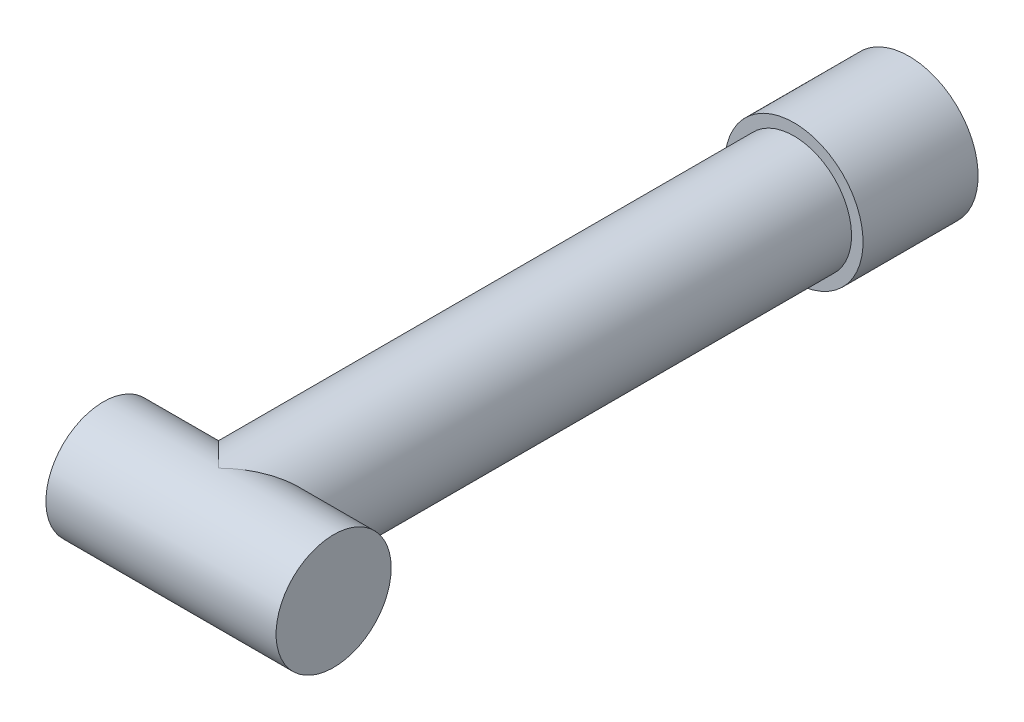
ISO-10303-21;
HEADER;
FILE_DESCRIPTION(('STEP AP214'),'2;1');
FILE_NAME('part.step','',(''),(''),'','','');
FILE_SCHEMA(('AUTOMOTIVE_DESIGN { 1 0 10303 214 1 1 1 1 }'));
ENDSEC;
DATA;
#1=APPLICATION_CONTEXT('core data for automotive mechanical design processes');
#2=APPLICATION_PROTOCOL_DEFINITION('international standard','automotive_design',2000,#1);
#3=PRODUCT_CONTEXT('',#1,'mechanical');
#4=PRODUCT('Part','Part','',(#3));
#5=PRODUCT_RELATED_PRODUCT_CATEGORY('part','',(#4));
#6=PRODUCT_DEFINITION_FORMATION('','',#4);
#7=PRODUCT_DEFINITION_CONTEXT('part definition',#1,'design');
#8=PRODUCT_DEFINITION('design','',#6,#7);
#9=PRODUCT_DEFINITION_SHAPE('','',#8);
#10=(LENGTH_UNIT() NAMED_UNIT(*) SI_UNIT(.MILLI.,.METRE.));
#11=(NAMED_UNIT(*) PLANE_ANGLE_UNIT() SI_UNIT($,.RADIAN.));
#12=(NAMED_UNIT(*) SI_UNIT($,.STERADIAN.) SOLID_ANGLE_UNIT());
#13=UNCERTAINTY_MEASURE_WITH_UNIT(LENGTH_MEASURE(1.E-05),#10,'distance_accuracy_value','');
#14=(GEOMETRIC_REPRESENTATION_CONTEXT(3) GLOBAL_UNCERTAINTY_ASSIGNED_CONTEXT((#13)) GLOBAL_UNIT_ASSIGNED_CONTEXT((#10,
#11,#12)) REPRESENTATION_CONTEXT('',''));
#15=CARTESIAN_POINT('',(0.,0.,0.));
#16=DIRECTION('',(0.,0.,1.));
#17=DIRECTION('',(1.,0.,0.));
#18=AXIS2_PLACEMENT_3D('',#15,#16,#17);
#19=CARTESIAN_POINT('',(0.,0.,-30.));
#20=DIRECTION('',(0.,0.,1.));
#21=DIRECTION('',(1.,0.,0.));
#22=AXIS2_PLACEMENT_3D('',#19,#20,#21);
#23=CYLINDRICAL_SURFACE('',#22,2.5);
#24=CARTESIAN_POINT('',(0.,0.,0.));
#25=DIRECTION('',(0.707106781186547,0.,0.707106781186547));
#26=DIRECTION('',(-0.707106781186547,0.,0.707106781186547));
#27=AXIS2_PLACEMENT_3D('',#24,#25,#26);
#28=ELLIPSE('',#27,3.53553390593274,2.5);
#29=CARTESIAN_POINT('',(0.,-2.5,0.));
#30=VERTEX_POINT('',#29);
#31=CARTESIAN_POINT('',(0.,2.5,0.));
#32=VERTEX_POINT('',#31);
#33=EDGE_CURVE('E11',#30,#32,#28,.T.);
#34=ORIENTED_EDGE('',*,*,#33,.F.);
#35=CARTESIAN_POINT('',(0.,0.,0.));
#36=DIRECTION('',(-0.707106781186547,0.,0.707106781186547));
#37=DIRECTION('',(0.707106781186547,0.,0.707106781186547));
#38=AXIS2_PLACEMENT_3D('',#35,#36,#37);
#39=ELLIPSE('',#38,3.53553390593274,2.5);
#40=EDGE_CURVE('E42',#32,#30,#39,.T.);
#41=ORIENTED_EDGE('',*,*,#40,.F.);
#42=EDGE_LOOP('',(#34,#41));
#43=FACE_BOUND('',#42,.T.);
#44=CARTESIAN_POINT('',(0.,0.,-25.));
#45=DIRECTION('',(0.,0.,-1.));
#46=DIRECTION('',(-1.,0.,0.));
#47=AXIS2_PLACEMENT_3D('',#44,#45,#46);
#48=CIRCLE('',#47,2.5);
#49=CARTESIAN_POINT('',(-2.5,0.,-25.));
#50=VERTEX_POINT('',#49);
#51=EDGE_CURVE('E37',#50,#50,#48,.F.);
#52=ORIENTED_EDGE('',*,*,#51,.T.);
#53=EDGE_LOOP('',(#52));
#54=FACE_BOUND('',#53,.T.);
#55=ADVANCED_FACE('F34',(#43,#54),#23,.T.);
#56=CARTESIAN_POINT('',(-5.,0.,0.));
#57=DIRECTION('',(1.,0.,0.));
#58=DIRECTION('',(0.,0.,-1.));
#59=AXIS2_PLACEMENT_3D('',#56,#57,#58);
#60=CYLINDRICAL_SURFACE('',#59,2.5);
#61=ORIENTED_EDGE('',*,*,#40,.T.);
#62=ORIENTED_EDGE('',*,*,#33,.T.);
#63=EDGE_LOOP('',(#61,#62));
#64=FACE_BOUND('',#63,.T.);
#65=CARTESIAN_POINT('',(-5.,0.,0.));
#66=DIRECTION('',(1.,0.,0.));
#67=DIRECTION('',(0.,0.,-1.));
#68=AXIS2_PLACEMENT_3D('',#65,#66,#67);
#69=CIRCLE('',#68,2.5);
#70=CARTESIAN_POINT('',(-5.,0.,-2.5));
#71=VERTEX_POINT('',#70);
#72=EDGE_CURVE('E52',#71,#71,#69,.T.);
#73=ORIENTED_EDGE('',*,*,#72,.T.);
#74=EDGE_LOOP('',(#73));
#75=FACE_BOUND('',#74,.T.);
#76=CARTESIAN_POINT('',(5.,0.,0.));
#77=DIRECTION('',(1.,0.,0.));
#78=DIRECTION('',(0.,0.,-1.));
#79=AXIS2_PLACEMENT_3D('',#76,#77,#78);
#80=CIRCLE('',#79,2.5);
#81=CARTESIAN_POINT('',(5.,0.,-2.5));
#82=VERTEX_POINT('',#81);
#83=EDGE_CURVE('E55',#82,#82,#80,.T.);
#84=ORIENTED_EDGE('',*,*,#83,.F.);
#85=EDGE_LOOP('',(#84));
#86=FACE_BOUND('',#85,.T.);
#87=ADVANCED_FACE('F50',(#64,#75,#86),#60,.T.);
#88=CARTESIAN_POINT('',(-5.,0.,0.));
#89=DIRECTION('',(1.,0.,0.));
#90=DIRECTION('',(0.,0.,-1.));
#91=AXIS2_PLACEMENT_3D('',#88,#89,#90);
#92=PLANE('',#91);
#93=ORIENTED_EDGE('',*,*,#72,.F.);
#94=EDGE_LOOP('',(#93));
#95=FACE_BOUND('',#94,.T.);
#96=ADVANCED_FACE('F87',(#95),#92,.F.);
#97=CARTESIAN_POINT('',(5.,0.,0.));
#98=DIRECTION('',(1.,0.,0.));
#99=DIRECTION('',(0.,0.,-1.));
#100=AXIS2_PLACEMENT_3D('',#97,#98,#99);
#101=PLANE('',#100);
#102=ORIENTED_EDGE('',*,*,#83,.T.);
#103=EDGE_LOOP('',(#102));
#104=FACE_BOUND('',#103,.T.);
#105=ADVANCED_FACE('F81',(#104),#101,.T.);
#106=CARTESIAN_POINT('',(0.,0.,-25.));
#107=DIRECTION('',(0.,0.,-1.));
#108=DIRECTION('',(-1.,0.,0.));
#109=AXIS2_PLACEMENT_3D('',#106,#107,#108);
#110=CYLINDRICAL_SURFACE('',#109,3.);
#111=CARTESIAN_POINT('',(0.,0.,-25.));
#112=DIRECTION('',(0.,0.,-1.));
#113=DIRECTION('',(-1.,0.,0.));
#114=AXIS2_PLACEMENT_3D('',#111,#112,#113);
#115=CIRCLE('',#114,3.);
#116=CARTESIAN_POINT('',(-3.,0.,-25.));
#117=VERTEX_POINT('',#116);
#118=EDGE_CURVE('E63',#117,#117,#115,.T.);
#119=ORIENTED_EDGE('',*,*,#118,.T.);
#120=EDGE_LOOP('',(#119));
#121=FACE_BOUND('',#120,.T.);
#122=CARTESIAN_POINT('',(0.,0.,-30.));
#123=DIRECTION('',(0.,0.,-1.));
#124=DIRECTION('',(-1.,0.,0.));
#125=AXIS2_PLACEMENT_3D('',#122,#123,#124);
#126=CIRCLE('',#125,3.);
#127=CARTESIAN_POINT('',(-3.,0.,-30.));
#128=VERTEX_POINT('',#127);
#129=EDGE_CURVE('E60',#128,#128,#126,.T.);
#130=ORIENTED_EDGE('',*,*,#129,.F.);
#131=EDGE_LOOP('',(#130));
#132=FACE_BOUND('',#131,.T.);
#133=ADVANCED_FACE('F74',(#121,#132),#110,.T.);
#134=CARTESIAN_POINT('',(0.,0.,-25.));
#135=DIRECTION('',(0.,0.,-1.));
#136=DIRECTION('',(-1.,0.,0.));
#137=AXIS2_PLACEMENT_3D('',#134,#135,#136);
#138=PLANE('',#137);
#139=ORIENTED_EDGE('',*,*,#51,.F.);
#140=EDGE_LOOP('',(#139));
#141=FACE_BOUND('',#140,.T.);
#142=ORIENTED_EDGE('',*,*,#118,.F.);
#143=EDGE_LOOP('',(#142));
#144=FACE_BOUND('',#143,.T.);
#145=ADVANCED_FACE('F70',(#141,#144),#138,.F.);
#146=CARTESIAN_POINT('',(0.,0.,-30.));
#147=DIRECTION('',(0.,0.,1.));
#148=DIRECTION('',(1.,0.,0.));
#149=AXIS2_PLACEMENT_3D('',#146,#147,#148);
#150=PLANE('',#149);
#151=ORIENTED_EDGE('',*,*,#129,.T.);
#152=EDGE_LOOP('',(#151));
#153=FACE_BOUND('',#152,.T.);
#154=ADVANCED_FACE('F73',(#153),#150,.F.);
#155=CLOSED_SHELL('',(#55,#87,#96,#105,#133,#145,#154));
#156=MANIFOLD_SOLID_BREP('B2',#155);
#157=ADVANCED_BREP_SHAPE_REPRESENTATION('',(#18,#156),#14);
#158=SHAPE_DEFINITION_REPRESENTATION(#9,#157);
ENDSEC;
END-ISO-10303-21;
